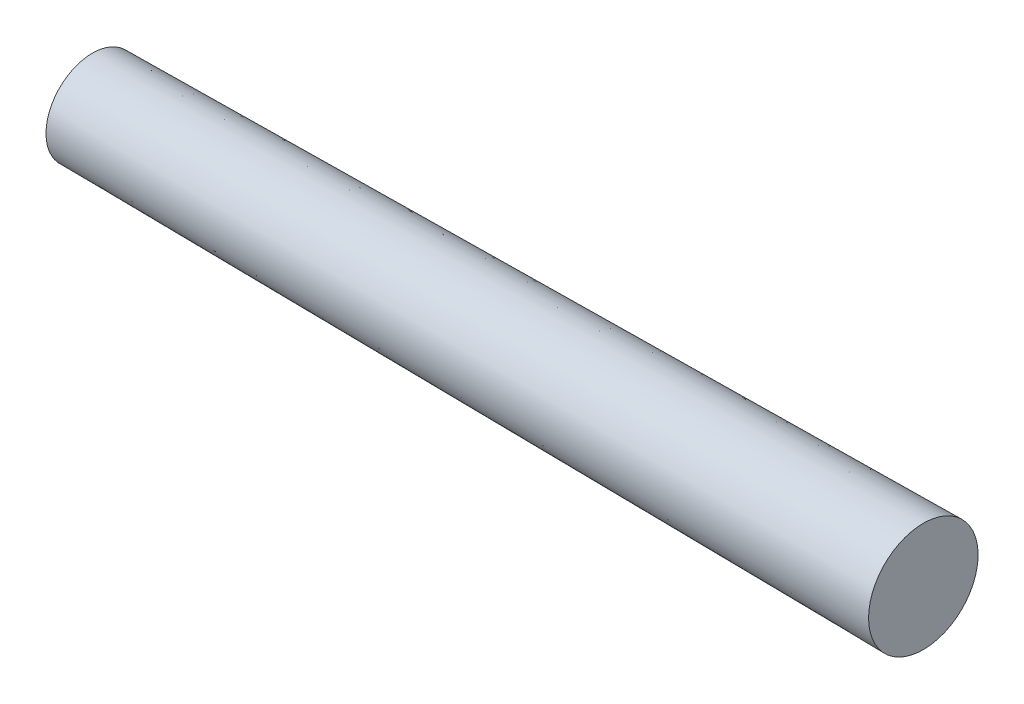
ISO-10303-21;
HEADER;
FILE_DESCRIPTION(('STEP AP214'),'2;1');
FILE_NAME('part.step','',(''),(''),'','','');
FILE_SCHEMA(('AUTOMOTIVE_DESIGN { 1 0 10303 214 1 1 1 1 }'));
ENDSEC;
DATA;
#1=APPLICATION_CONTEXT('core data for automotive mechanical design processes');
#2=APPLICATION_PROTOCOL_DEFINITION('international standard','automotive_design',2000,#1);
#3=PRODUCT_CONTEXT('',#1,'mechanical');
#4=PRODUCT('Part','Part','',(#3));
#5=PRODUCT_RELATED_PRODUCT_CATEGORY('part','',(#4));
#6=PRODUCT_DEFINITION_FORMATION('','',#4);
#7=PRODUCT_DEFINITION_CONTEXT('part definition',#1,'design');
#8=PRODUCT_DEFINITION('design','',#6,#7);
#9=PRODUCT_DEFINITION_SHAPE('','',#8);
#10=(LENGTH_UNIT() NAMED_UNIT(*) SI_UNIT(.MILLI.,.METRE.));
#11=(NAMED_UNIT(*) PLANE_ANGLE_UNIT() SI_UNIT($,.RADIAN.));
#12=(NAMED_UNIT(*) SI_UNIT($,.STERADIAN.) SOLID_ANGLE_UNIT());
#13=UNCERTAINTY_MEASURE_WITH_UNIT(LENGTH_MEASURE(1.E-05),#10,'distance_accuracy_value','');
#14=(GEOMETRIC_REPRESENTATION_CONTEXT(3) GLOBAL_UNCERTAINTY_ASSIGNED_CONTEXT((#13)) GLOBAL_UNIT_ASSIGNED_CONTEXT((#10,
#11,#12)) REPRESENTATION_CONTEXT('',''));
#15=CARTESIAN_POINT('',(0.,0.,0.));
#16=DIRECTION('',(0.,0.,1.));
#17=DIRECTION('',(1.,0.,0.));
#18=AXIS2_PLACEMENT_3D('',#15,#16,#17);
#19=CARTESIAN_POINT('',(0.,6.15,0.));
#20=DIRECTION('',(1.,0.,0.));
#21=DIRECTION('',(0.,0.,-1.));
#22=AXIS2_PLACEMENT_3D('',#19,#20,#21);
#23=PLANE('',#22);
#24=CARTESIAN_POINT('',(0.,0.,0.));
#25=DIRECTION('',(-1.,0.,0.));
#26=DIRECTION('',(0.,0.,1.));
#27=AXIS2_PLACEMENT_3D('',#24,#25,#26);
#28=CIRCLE('',#27,6.15);
#29=CARTESIAN_POINT('',(0.,0.,6.15));
#30=VERTEX_POINT('',#29);
#31=EDGE_CURVE('E10',#30,#30,#28,.T.);
#32=ORIENTED_EDGE('',*,*,#31,.T.);
#33=EDGE_LOOP('',(#32));
#34=FACE_BOUND('',#33,.T.);
#35=ADVANCED_FACE('F43',(#34),#23,.F.);
#36=CARTESIAN_POINT('',(110.,0.,0.));
#37=DIRECTION('',(1.,0.,0.));
#38=DIRECTION('',(0.,0.,-1.));
#39=AXIS2_PLACEMENT_3D('',#36,#37,#38);
#40=CONICAL_SURFACE('',#39,7.25,0.00999966668666523);
#41=ORIENTED_EDGE('',*,*,#31,.F.);
#42=EDGE_LOOP('',(#41));
#43=FACE_BOUND('',#42,.T.);
#44=CARTESIAN_POINT('',(110.,0.,0.));
#45=DIRECTION('',(-1.,0.,0.));
#46=DIRECTION('',(0.,0.,1.));
#47=AXIS2_PLACEMENT_3D('',#44,#45,#46);
#48=CIRCLE('',#47,7.25);
#49=CARTESIAN_POINT('',(110.,0.,7.25));
#50=VERTEX_POINT('',#49);
#51=EDGE_CURVE('E50',#50,#50,#48,.T.);
#52=ORIENTED_EDGE('',*,*,#51,.T.);
#53=EDGE_LOOP('',(#52));
#54=FACE_BOUND('',#53,.T.);
#55=ADVANCED_FACE('F57',(#43,#54),#40,.T.);
#56=CARTESIAN_POINT('',(110.,7.25,0.));
#57=DIRECTION('',(-1.,0.,0.));
#58=DIRECTION('',(0.,0.,1.));
#59=AXIS2_PLACEMENT_3D('',#56,#57,#58);
#60=PLANE('',#59);
#61=ORIENTED_EDGE('',*,*,#51,.F.);
#62=EDGE_LOOP('',(#61));
#63=FACE_BOUND('',#62,.T.);
#64=ADVANCED_FACE('F59',(#63),#60,.F.);
#65=CLOSED_SHELL('',(#35,#55,#64));
#66=MANIFOLD_SOLID_BREP('B2',#65);
#67=ADVANCED_BREP_SHAPE_REPRESENTATION('',(#18,#66),#14);
#68=SHAPE_DEFINITION_REPRESENTATION(#9,#67);
ENDSEC;
END-ISO-10303-21;
